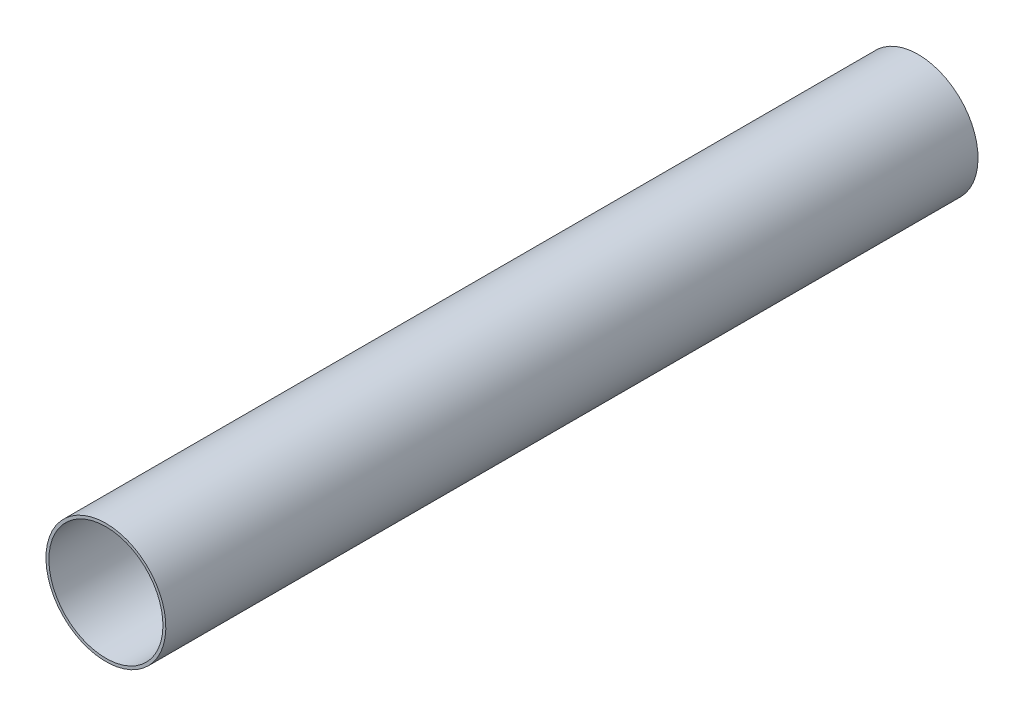
ISO-10303-21;
HEADER;
FILE_DESCRIPTION(('STEP AP214'),'2;1');
FILE_NAME('part.step','',(''),(''),'','','');
FILE_SCHEMA(('AUTOMOTIVE_DESIGN { 1 0 10303 214 1 1 1 1 }'));
ENDSEC;
DATA;
#1=APPLICATION_CONTEXT('core data for automotive mechanical design processes');
#2=APPLICATION_PROTOCOL_DEFINITION('international standard','automotive_design',2000,#1);
#3=PRODUCT_CONTEXT('',#1,'mechanical');
#4=PRODUCT('Part','Part','',(#3));
#5=PRODUCT_RELATED_PRODUCT_CATEGORY('part','',(#4));
#6=PRODUCT_DEFINITION_FORMATION('','',#4);
#7=PRODUCT_DEFINITION_CONTEXT('part definition',#1,'design');
#8=PRODUCT_DEFINITION('design','',#6,#7);
#9=PRODUCT_DEFINITION_SHAPE('','',#8);
#10=(LENGTH_UNIT() NAMED_UNIT(*) SI_UNIT(.MILLI.,.METRE.));
#11=(NAMED_UNIT(*) PLANE_ANGLE_UNIT() SI_UNIT($,.RADIAN.));
#12=(NAMED_UNIT(*) SI_UNIT($,.STERADIAN.) SOLID_ANGLE_UNIT());
#13=UNCERTAINTY_MEASURE_WITH_UNIT(LENGTH_MEASURE(1.E-05),#10,'distance_accuracy_value','');
#14=(GEOMETRIC_REPRESENTATION_CONTEXT(3) GLOBAL_UNCERTAINTY_ASSIGNED_CONTEXT((#13)) GLOBAL_UNIT_ASSIGNED_CONTEXT((#10,
#11,#12)) REPRESENTATION_CONTEXT('',''));
#15=CARTESIAN_POINT('',(0.,0.,0.));
#16=DIRECTION('',(0.,0.,1.));
#17=DIRECTION('',(1.,0.,0.));
#18=AXIS2_PLACEMENT_3D('',#15,#16,#17);
#19=CARTESIAN_POINT('',(0.,0.,0.));
#20=DIRECTION('',(0.,0.,-1.));
#21=DIRECTION('',(0.,1.,0.));
#22=AXIS2_PLACEMENT_3D('',#19,#20,#21);
#23=CYLINDRICAL_SURFACE('',#22,49.149);
#24=CARTESIAN_POINT('',(0.,0.,10.));
#25=DIRECTION('',(0.,0.,-1.));
#26=DIRECTION('',(0.,1.,0.));
#27=AXIS2_PLACEMENT_3D('',#24,#25,#26);
#28=CIRCLE('',#27,49.149);
#29=CARTESIAN_POINT('',(0.,49.149,10.));
#30=VERTEX_POINT('',#29);
#31=EDGE_CURVE('E42',#30,#30,#28,.T.);
#32=ORIENTED_EDGE('',*,*,#31,.T.);
#33=EDGE_LOOP('',(#32));
#34=FACE_BOUND('',#33,.T.);
#35=CARTESIAN_POINT('',(0.,0.,710.));
#36=DIRECTION('',(0.,0.,-1.));
#37=DIRECTION('',(0.,1.,0.));
#38=AXIS2_PLACEMENT_3D('',#35,#36,#37);
#39=CIRCLE('',#38,49.149);
#40=CARTESIAN_POINT('',(0.,49.1489999999999,710.));
#41=VERTEX_POINT('',#40);
#42=EDGE_CURVE('E10',#41,#41,#39,.T.);
#43=ORIENTED_EDGE('',*,*,#42,.F.);
#44=EDGE_LOOP('',(#43));
#45=FACE_BOUND('',#44,.T.);
#46=ADVANCED_FACE('F28',(#34,#45),#23,.F.);
#47=CARTESIAN_POINT('',(0.,49.1489999999999,710.));
#48=DIRECTION('',(0.,0.,1.));
#49=DIRECTION('',(0.,-1.,0.));
#50=AXIS2_PLACEMENT_3D('',#47,#48,#49);
#51=PLANE('',#50);
#52=ORIENTED_EDGE('',*,*,#42,.T.);
#53=EDGE_LOOP('',(#52));
#54=FACE_BOUND('',#53,.T.);
#55=CARTESIAN_POINT('',(0.,0.,710.));
#56=DIRECTION('',(0.,0.,-1.));
#57=DIRECTION('',(0.,1.,0.));
#58=AXIS2_PLACEMENT_3D('',#55,#56,#57);
#59=CIRCLE('',#58,51.649);
#60=CARTESIAN_POINT('',(0.,51.6489999999999,710.));
#61=VERTEX_POINT('',#60);
#62=EDGE_CURVE('E34',#61,#61,#59,.T.);
#63=ORIENTED_EDGE('',*,*,#62,.F.);
#64=EDGE_LOOP('',(#63));
#65=FACE_BOUND('',#64,.T.);
#66=ADVANCED_FACE('F58',(#54,#65),#51,.T.);
#67=CARTESIAN_POINT('',(0.,0.,0.));
#68=DIRECTION('',(0.,0.,-1.));
#69=DIRECTION('',(0.,1.,0.));
#70=AXIS2_PLACEMENT_3D('',#67,#68,#69);
#71=CYLINDRICAL_SURFACE('',#70,51.649);
#72=ORIENTED_EDGE('',*,*,#62,.T.);
#73=EDGE_LOOP('',(#72));
#74=FACE_BOUND('',#73,.T.);
#75=CARTESIAN_POINT('',(0.,0.,10.));
#76=DIRECTION('',(0.,0.,-1.));
#77=DIRECTION('',(0.,1.,0.));
#78=AXIS2_PLACEMENT_3D('',#75,#76,#77);
#79=CIRCLE('',#78,51.6489999999999);
#80=CARTESIAN_POINT('',(0.,51.6489999999999,10.));
#81=VERTEX_POINT('',#80);
#82=EDGE_CURVE('E38',#81,#81,#79,.T.);
#83=ORIENTED_EDGE('',*,*,#82,.F.);
#84=EDGE_LOOP('',(#83));
#85=FACE_BOUND('',#84,.T.);
#86=ADVANCED_FACE('F52',(#74,#85),#71,.T.);
#87=CARTESIAN_POINT('',(0.,51.6489999999999,10.));
#88=DIRECTION('',(0.,0.,-1.));
#89=DIRECTION('',(0.,1.,0.));
#90=AXIS2_PLACEMENT_3D('',#87,#88,#89);
#91=PLANE('',#90);
#92=ORIENTED_EDGE('',*,*,#82,.T.);
#93=EDGE_LOOP('',(#92));
#94=FACE_BOUND('',#93,.T.);
#95=ORIENTED_EDGE('',*,*,#31,.F.);
#96=EDGE_LOOP('',(#95));
#97=FACE_BOUND('',#96,.T.);
#98=ADVANCED_FACE('F50',(#94,#97),#91,.T.);
#99=CLOSED_SHELL('',(#46,#66,#86,#98));
#100=MANIFOLD_SOLID_BREP('B2',#99);
#101=ADVANCED_BREP_SHAPE_REPRESENTATION('',(#18,#100),#14);
#102=SHAPE_DEFINITION_REPRESENTATION(#9,#101);
ENDSEC;
END-ISO-10303-21;
